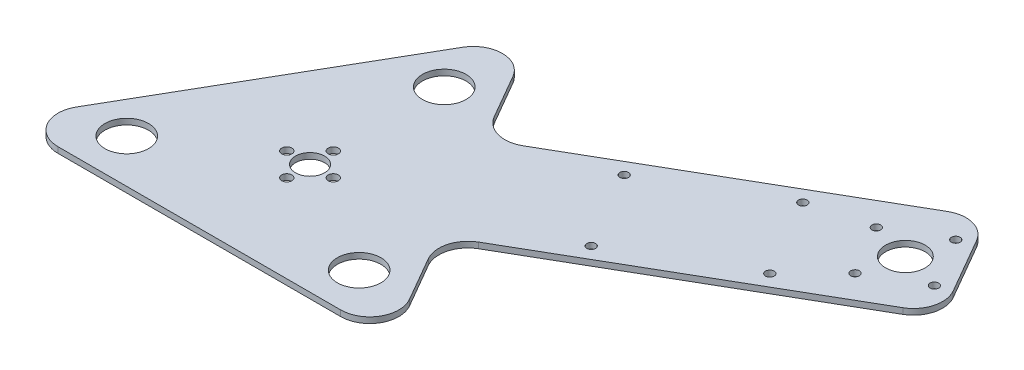
ISO-10303-21;
HEADER;
FILE_DESCRIPTION(('STEP AP214'),'2;1');
FILE_NAME('part.step','',(''),(''),'','','');
FILE_SCHEMA(('AUTOMOTIVE_DESIGN { 1 0 10303 214 1 1 1 1 }'));
ENDSEC;
DATA;
#1=APPLICATION_CONTEXT('core data for automotive mechanical design processes');
#2=APPLICATION_PROTOCOL_DEFINITION('international standard','automotive_design',2000,#1);
#3=PRODUCT_CONTEXT('',#1,'mechanical');
#4=PRODUCT('Part','Part','',(#3));
#5=PRODUCT_RELATED_PRODUCT_CATEGORY('part','',(#4));
#6=PRODUCT_DEFINITION_FORMATION('','',#4);
#7=PRODUCT_DEFINITION_CONTEXT('part definition',#1,'design');
#8=PRODUCT_DEFINITION('design','',#6,#7);
#9=PRODUCT_DEFINITION_SHAPE('','',#8);
#10=(LENGTH_UNIT() NAMED_UNIT(*) SI_UNIT(.MILLI.,.METRE.));
#11=(NAMED_UNIT(*) PLANE_ANGLE_UNIT() SI_UNIT($,.RADIAN.));
#12=(NAMED_UNIT(*) SI_UNIT($,.STERADIAN.) SOLID_ANGLE_UNIT());
#13=UNCERTAINTY_MEASURE_WITH_UNIT(LENGTH_MEASURE(1.E-05),#10,'distance_accuracy_value','');
#14=(GEOMETRIC_REPRESENTATION_CONTEXT(3) GLOBAL_UNCERTAINTY_ASSIGNED_CONTEXT((#13)) GLOBAL_UNIT_ASSIGNED_CONTEXT((#10,
#11,#12)) REPRESENTATION_CONTEXT('',''));
#15=CARTESIAN_POINT('',(0.,0.,0.));
#16=DIRECTION('',(0.,0.,1.));
#17=DIRECTION('',(1.,0.,0.));
#18=AXIS2_PLACEMENT_3D('',#15,#16,#17);
#19=CARTESIAN_POINT('',(65.9807621135332,2.,38.0940107675853));
#20=DIRECTION('',(-0.866025403784439,0.,0.5));
#21=DIRECTION('',(0.5,0.,0.866025403784439));
#22=AXIS2_PLACEMENT_3D('',#19,#20,#21);
#23=PLANE('',#22);
#24=DIRECTION('',(-0.5,0.,-0.866025403784439));
#25=VECTOR('',#24,1.);
#26=CARTESIAN_POINT('',(65.9807621135332,2.,38.0940107675853));
#27=LINE('',#26,#25);
#28=CARTESIAN_POINT('',(17.4903810567665,2.,-45.8937929011101));
#29=VERTEX_POINT('',#28);
#30=CARTESIAN_POINT('',(8.66025403784439,2.,-61.1880215351698));
#31=VERTEX_POINT('',#30);
#32=EDGE_CURVE('E306',#29,#31,#27,.T.);
#33=ORIENTED_EDGE('',*,*,#32,.F.);
#34=DIRECTION('',(0.,1.,0.));
#35=VECTOR('',#34,1.);
#36=CARTESIAN_POINT('',(17.4903810567665,2.,-45.89379290111));
#37=LINE('',#36,#35);
#38=CARTESIAN_POINT('',(17.4903810567665,0.,-45.8937929011101));
#39=VERTEX_POINT('',#38);
#40=EDGE_CURVE('E196',#29,#39,#37,.F.);
#41=ORIENTED_EDGE('',*,*,#40,.T.);
#42=DIRECTION('',(-0.5,0.,-0.866025403784439));
#43=VECTOR('',#42,1.);
#44=CARTESIAN_POINT('',(65.9807621135332,0.,38.0940107675853));
#45=LINE('',#44,#43);
#46=CARTESIAN_POINT('',(8.66025403784439,0.,-61.1880215351698));
#47=VERTEX_POINT('',#46);
#48=EDGE_CURVE('E303',#39,#47,#45,.T.);
#49=ORIENTED_EDGE('',*,*,#48,.T.);
#50=DIRECTION('',(0.,-1.,0.));
#51=VECTOR('',#50,1.);
#52=CARTESIAN_POINT('',(8.66025403784439,2.,-61.1880215351698));
#53=LINE('',#52,#51);
#54=EDGE_CURVE('E194',#47,#31,#53,.F.);
#55=ORIENTED_EDGE('',*,*,#54,.T.);
#56=EDGE_LOOP('',(#33,#41,#49,#55));
#57=FACE_BOUND('',#56,.T.);
#58=ADVANCED_FACE('F34',(#57),#23,.F.);
#59=CARTESIAN_POINT('',(0.,2.,0.));
#60=DIRECTION('',(0.,1.,0.));
#61=DIRECTION('',(0.,0.,1.));
#62=AXIS2_PLACEMENT_3D('',#59,#60,#61);
#63=PLANE('',#62);
#64=CARTESIAN_POINT('',(8.,2.,0.));
#65=DIRECTION('',(0.,1.,0.));
#66=DIRECTION('',(0.,0.,1.));
#67=AXIS2_PLACEMENT_3D('',#64,#65,#66);
#68=CIRCLE('',#67,1.75);
#69=CARTESIAN_POINT('',(8.,2.,1.75));
#70=VERTEX_POINT('',#69);
#71=EDGE_CURVE('E664',#70,#70,#68,.T.);
#72=ORIENTED_EDGE('',*,*,#71,.F.);
#73=EDGE_LOOP('',(#72));
#74=FACE_BOUND('',#73,.T.);
#75=CARTESIAN_POINT('',(0.,2.,8.));
#76=DIRECTION('',(0.,1.,0.));
#77=DIRECTION('',(0.,0.,1.));
#78=AXIS2_PLACEMENT_3D('',#75,#76,#77);
#79=CIRCLE('',#78,1.75);
#80=CARTESIAN_POINT('',(0.,2.,9.75));
#81=VERTEX_POINT('',#80);
#82=EDGE_CURVE('E670',#81,#81,#79,.T.);
#83=ORIENTED_EDGE('',*,*,#82,.F.);
#84=EDGE_LOOP('',(#83));
#85=FACE_BOUND('',#84,.T.);
#86=CARTESIAN_POINT('',(-8.,2.,0.));
#87=DIRECTION('',(0.,1.,0.));
#88=DIRECTION('',(0.,0.,1.));
#89=AXIS2_PLACEMENT_3D('',#86,#87,#88);
#90=CIRCLE('',#89,1.75);
#91=CARTESIAN_POINT('',(-8.,2.,1.75));
#92=VERTEX_POINT('',#91);
#93=EDGE_CURVE('E678',#92,#92,#90,.T.);
#94=ORIENTED_EDGE('',*,*,#93,.F.);
#95=EDGE_LOOP('',(#94));
#96=FACE_BOUND('',#95,.T.);
#97=CARTESIAN_POINT('',(0.,2.,-8.));
#98=DIRECTION('',(0.,1.,0.));
#99=DIRECTION('',(0.,0.,1.));
#100=AXIS2_PLACEMENT_3D('',#97,#98,#99);
#101=CIRCLE('',#100,1.75);
#102=CARTESIAN_POINT('',(0.,2.,-6.25));
#103=VERTEX_POINT('',#102);
#104=EDGE_CURVE('E667',#103,#103,#101,.T.);
#105=ORIENTED_EDGE('',*,*,#104,.F.);
#106=EDGE_LOOP('',(#105));
#107=FACE_BOUND('',#106,.T.);
#108=CARTESIAN_POINT('',(57.2019052838329,2.,-50.9233937586588));
#109=DIRECTION('',(0.,1.,0.));
#110=DIRECTION('',(0.,0.,1.));
#111=AXIS2_PLACEMENT_3D('',#108,#109,#110);
#112=CIRCLE('',#111,1.5);
#113=CARTESIAN_POINT('',(57.2019052838329,2.,-49.4233937586588));
#114=VERTEX_POINT('',#113);
#115=EDGE_CURVE('E245',#114,#114,#112,.T.);
#116=ORIENTED_EDGE('',*,*,#115,.F.);
#117=EDGE_LOOP('',(#116));
#118=FACE_BOUND('',#117,.T.);
#119=CARTESIAN_POINT('',(111.673048454133,2.,-46.5766062413412));
#120=DIRECTION('',(0.,1.,0.));
#121=DIRECTION('',(0.,0.,1.));
#122=AXIS2_PLACEMENT_3D('',#119,#120,#121);
#123=CIRCLE('',#122,1.5);
#124=CARTESIAN_POINT('',(111.673048454133,2.,-45.0766062413412));
#125=VERTEX_POINT('',#124);
#126=EDGE_CURVE('E687',#125,#125,#123,.T.);
#127=ORIENTED_EDGE('',*,*,#126,.F.);
#128=EDGE_LOOP('',(#127));
#129=FACE_BOUND('',#128,.T.);
#130=CARTESIAN_POINT('',(72.7019052838329,2.,-24.0766062413412));
#131=DIRECTION('',(0.,1.,0.));
#132=DIRECTION('',(0.,0.,1.));
#133=AXIS2_PLACEMENT_3D('',#130,#131,#132);
#134=CIRCLE('',#133,1.5);
#135=CARTESIAN_POINT('',(72.7019052838329,2.,-22.5766062413412));
#136=VERTEX_POINT('',#135);
#137=EDGE_CURVE('E258',#136,#136,#134,.T.);
#138=ORIENTED_EDGE('',*,*,#137,.F.);
#139=EDGE_LOOP('',(#138));
#140=FACE_BOUND('',#139,.T.);
#141=CARTESIAN_POINT('',(96.1730484541326,2.,-73.4233937586588));
#142=DIRECTION('',(0.,1.,0.));
#143=DIRECTION('',(0.,0.,1.));
#144=AXIS2_PLACEMENT_3D('',#141,#142,#143);
#145=CIRCLE('',#144,1.5);
#146=CARTESIAN_POINT('',(96.1730484541326,2.,-71.9233937586588));
#147=VERTEX_POINT('',#146);
#148=EDGE_CURVE('E241',#147,#147,#145,.T.);
#149=ORIENTED_EDGE('',*,*,#148,.F.);
#150=EDGE_LOOP('',(#149));
#151=FACE_BOUND('',#150,.T.);
#152=CARTESIAN_POINT('',(116.243556529821,2.,-78.6602540378444));
#153=DIRECTION('',(0.,1.,0.));
#154=DIRECTION('',(0.,0.,1.));
#155=AXIS2_PLACEMENT_3D('',#152,#153,#154);
#156=CIRCLE('',#155,1.5);
#157=CARTESIAN_POINT('',(116.243556529821,2.,-77.1602540378444));
#158=VERTEX_POINT('',#157);
#159=EDGE_CURVE('E231',#158,#158,#156,.T.);
#160=ORIENTED_EDGE('',*,*,#159,.F.);
#161=EDGE_LOOP('',(#160));
#162=FACE_BOUND('',#161,.T.);
#163=CARTESIAN_POINT('',(126.243556529821,2.,-61.3397459621556));
#164=DIRECTION('',(0.,1.,0.));
#165=DIRECTION('',(0.,0.,1.));
#166=AXIS2_PLACEMENT_3D('',#163,#164,#165);
#167=CIRCLE('',#166,1.5);
#168=CARTESIAN_POINT('',(126.243556529821,2.,-59.8397459621556));
#169=VERTEX_POINT('',#168);
#170=EDGE_CURVE('E262',#169,#169,#167,.T.);
#171=ORIENTED_EDGE('',*,*,#170,.F.);
#172=EDGE_LOOP('',(#171));
#173=FACE_BOUND('',#172,.T.);
#174=CARTESIAN_POINT('',(143.56406460551,2.,-71.3397459621556));
#175=DIRECTION('',(0.,1.,0.));
#176=DIRECTION('',(0.,0.,1.));
#177=AXIS2_PLACEMENT_3D('',#174,#175,#176);
#178=CIRCLE('',#177,1.5);
#179=CARTESIAN_POINT('',(143.56406460551,2.,-69.8397459621556));
#180=VERTEX_POINT('',#179);
#181=EDGE_CURVE('E240',#180,#180,#178,.T.);
#182=ORIENTED_EDGE('',*,*,#181,.F.);
#183=EDGE_LOOP('',(#182));
#184=FACE_BOUND('',#183,.T.);
#185=CARTESIAN_POINT('',(133.56406460551,2.,-88.6602540378444));
#186=DIRECTION('',(0.,1.,0.));
#187=DIRECTION('',(0.,0.,1.));
#188=AXIS2_PLACEMENT_3D('',#185,#186,#187);
#189=CIRCLE('',#188,1.5);
#190=CARTESIAN_POINT('',(133.56406460551,2.,-87.1602540378444));
#191=VERTEX_POINT('',#190);
#192=EDGE_CURVE('E226',#191,#191,#189,.T.);
#193=ORIENTED_EDGE('',*,*,#192,.F.);
#194=EDGE_LOOP('',(#193));
#195=FACE_BOUND('',#194,.T.);
#196=CARTESIAN_POINT('',(129.903810567666,2.,-75.));
#197=DIRECTION('',(0.,1.,0.));
#198=DIRECTION('',(0.,0.,1.));
#199=AXIS2_PLACEMENT_3D('',#196,#197,#198);
#200=CIRCLE('',#199,6.8);
#201=CARTESIAN_POINT('',(129.903810567666,2.,-68.2));
#202=VERTEX_POINT('',#201);
#203=EDGE_CURVE('E222',#202,#202,#200,.T.);
#204=ORIENTED_EDGE('',*,*,#203,.F.);
#205=EDGE_LOOP('',(#204));
#206=FACE_BOUND('',#205,.T.);
#207=CARTESIAN_POINT('',(40.,2.,23.0940107675853));
#208=DIRECTION('',(0.,1.,0.));
#209=DIRECTION('',(0.,0.,1.));
#210=AXIS2_PLACEMENT_3D('',#207,#208,#209);
#211=CIRCLE('',#210,7.5);
#212=CARTESIAN_POINT('',(40.,2.,30.5940107675853));
#213=VERTEX_POINT('',#212);
#214=EDGE_CURVE('E288',#213,#213,#211,.T.);
#215=ORIENTED_EDGE('',*,*,#214,.F.);
#216=EDGE_LOOP('',(#215));
#217=FACE_BOUND('',#216,.T.);
#218=CARTESIAN_POINT('',(0.,2.,-46.1880215351698));
#219=DIRECTION('',(0.,1.,0.));
#220=DIRECTION('',(0.,0.,1.));
#221=AXIS2_PLACEMENT_3D('',#218,#219,#220);
#222=CIRCLE('',#221,7.5);
#223=CARTESIAN_POINT('',(0.,2.,-38.6880215351698));
#224=VERTEX_POINT('',#223);
#225=EDGE_CURVE('E300',#224,#224,#222,.T.);
#226=ORIENTED_EDGE('',*,*,#225,.F.);
#227=EDGE_LOOP('',(#226));
#228=FACE_BOUND('',#227,.T.);
#229=DIRECTION('',(-0.5,0.,-0.866025403784438));
#230=VECTOR('',#229,1.);
#231=CARTESIAN_POINT('',(153.394191624432,2.,-64.3134665205268));
#232=LINE('',#231,#230);
#233=CARTESIAN_POINT('',(148.394191624432,2.,-72.9737205583712));
#234=VERTEX_POINT('',#233);
#235=CARTESIAN_POINT('',(137.394191624432,2.,-92.0262794416288));
#236=VERTEX_POINT('',#235);
#237=EDGE_CURVE('E142',#234,#236,#232,.T.);
#238=ORIENTED_EDGE('',*,*,#237,.T.);
#239=CARTESIAN_POINT('',(128.733937586588,2.,-87.0262794416289));
#240=DIRECTION('',(0.,1.,0.));
#241=DIRECTION('',(0.,0.,1.));
#242=AXIS2_PLACEMENT_3D('',#239,#240,#241);
#243=CIRCLE('',#242,10.);
#244=CARTESIAN_POINT('',(123.733937586588,2.,-95.6865334794733));
#245=VERTEX_POINT('',#244);
#246=EDGE_CURVE('E148',#236,#245,#243,.T.);
#247=ORIENTED_EDGE('',*,*,#246,.T.);
#248=DIRECTION('',(-0.866025403784439,0.,0.5));
#249=VECTOR('',#248,1.);
#250=CARTESIAN_POINT('',(22.4903810567665,2.,-37.2335388632657));
#251=LINE('',#250,#249);
#252=CARTESIAN_POINT('',(31.1506350946109,2.,-42.2335388632657));
#253=VERTEX_POINT('',#252);
#254=EDGE_CURVE('E158',#245,#253,#251,.T.);
#255=ORIENTED_EDGE('',*,*,#254,.T.);
#256=CARTESIAN_POINT('',(26.1506350946109,2.,-50.89379290111));
#257=DIRECTION('',(0.,1.,0.));
#258=DIRECTION('',(0.,0.,1.));
#259=AXIS2_PLACEMENT_3D('',#256,#257,#258);
#260=CIRCLE('',#259,10.);
#261=EDGE_CURVE('E214',#253,#29,#260,.F.);
#262=ORIENTED_EDGE('',*,*,#261,.T.);
#263=ORIENTED_EDGE('',*,*,#32,.T.);
#264=CARTESIAN_POINT('',(0.,2.,-56.1880215351698));
#265=DIRECTION('',(0.,1.,0.));
#266=DIRECTION('',(0.,0.,1.));
#267=AXIS2_PLACEMENT_3D('',#264,#265,#266);
#268=CIRCLE('',#267,10.);
#269=CARTESIAN_POINT('',(-8.66025403784439,2.,-61.1880215351698));
#270=VERTEX_POINT('',#269);
#271=EDGE_CURVE('E149',#31,#270,#268,.T.);
#272=ORIENTED_EDGE('',*,*,#271,.T.);
#273=DIRECTION('',(-0.5,0.,0.866025403784439));
#274=VECTOR('',#273,1.);
#275=CARTESIAN_POINT('',(0.,2.,-76.1880215351698));
#276=LINE('',#275,#274);
#277=CARTESIAN_POINT('',(-57.3205080756888,2.,23.0940107675853));
#278=VERTEX_POINT('',#277);
#279=EDGE_CURVE('E166',#270,#278,#276,.T.);
#280=ORIENTED_EDGE('',*,*,#279,.T.);
#281=CARTESIAN_POINT('',(-48.6602540378444,2.,28.0940107675853));
#282=DIRECTION('',(0.,1.,0.));
#283=DIRECTION('',(0.,0.,1.));
#284=AXIS2_PLACEMENT_3D('',#281,#282,#283);
#285=CIRCLE('',#284,10.);
#286=CARTESIAN_POINT('',(-48.6602540378444,2.,38.0940107675853));
#287=VERTEX_POINT('',#286);
#288=EDGE_CURVE('E163',#278,#287,#285,.T.);
#289=ORIENTED_EDGE('',*,*,#288,.T.);
#290=DIRECTION('',(1.,0.,0.));
#291=VECTOR('',#290,1.);
#292=CARTESIAN_POINT('',(-65.9807621135332,2.,38.0940107675853));
#293=LINE('',#292,#291);
#294=CARTESIAN_POINT('',(48.6602540378444,2.,38.0940107675853));
#295=VERTEX_POINT('',#294);
#296=EDGE_CURVE('E161',#287,#295,#293,.T.);
#297=ORIENTED_EDGE('',*,*,#296,.T.);
#298=CARTESIAN_POINT('',(48.6602540378444,2.,28.0940107675853));
#299=DIRECTION('',(0.,1.,0.));
#300=DIRECTION('',(0.,0.,1.));
#301=AXIS2_PLACEMENT_3D('',#298,#299,#300);
#302=CIRCLE('',#301,10.);
#303=CARTESIAN_POINT('',(57.3205080756888,2.,23.0940107675853));
#304=VERTEX_POINT('',#303);
#305=EDGE_CURVE('E173',#295,#304,#302,.T.);
#306=ORIENTED_EDGE('',*,*,#305,.T.);
#307=CARTESIAN_POINT('',(48.4903810567665,2.,7.79978213352515));
#308=VERTEX_POINT('',#307);
#309=EDGE_CURVE('E309',#304,#308,#27,.T.);
#310=ORIENTED_EDGE('',*,*,#309,.T.);
#311=CARTESIAN_POINT('',(57.1506350946109,2.,2.79978213352515));
#312=DIRECTION('',(0.,1.,0.));
#313=DIRECTION('',(0.,0.,1.));
#314=AXIS2_PLACEMENT_3D('',#311,#312,#313);
#315=CIRCLE('',#314,10.);
#316=CARTESIAN_POINT('',(52.1506350946109,2.,-5.86047190431924));
#317=VERTEX_POINT('',#316);
#318=EDGE_CURVE('E43',#308,#317,#315,.F.);
#319=ORIENTED_EDGE('',*,*,#318,.T.);
#320=DIRECTION('',(0.866025403784439,0.,-0.5));
#321=VECTOR('',#320,1.);
#322=CARTESIAN_POINT('',(43.4903810567665,2.,-0.860471904319243));
#323=LINE('',#322,#321);
#324=CARTESIAN_POINT('',(144.733937586588,2.,-59.3134665205268));
#325=VERTEX_POINT('',#324);
#326=EDGE_CURVE('E143',#317,#325,#323,.T.);
#327=ORIENTED_EDGE('',*,*,#326,.T.);
#328=CARTESIAN_POINT('',(139.733937586588,2.,-67.9737205583712));
#329=DIRECTION('',(0.,1.,0.));
#330=DIRECTION('',(0.,0.,1.));
#331=AXIS2_PLACEMENT_3D('',#328,#329,#330);
#332=CIRCLE('',#331,10.);
#333=EDGE_CURVE('E138',#325,#234,#332,.T.);
#334=ORIENTED_EDGE('',*,*,#333,.T.);
#335=EDGE_LOOP('',(#238,#247,#255,#262,#263,#272,#280,#289,#297,#306,#310,#319,#327,#334));
#336=FACE_BOUND('',#335,.T.);
#337=CARTESIAN_POINT('',(-40.,2.,23.0940107675853));
#338=DIRECTION('',(0.,1.,0.));
#339=DIRECTION('',(0.,0.,1.));
#340=AXIS2_PLACEMENT_3D('',#337,#338,#339);
#341=CIRCLE('',#340,7.5);
#342=CARTESIAN_POINT('',(-40.,2.,30.5940107675853));
#343=VERTEX_POINT('',#342);
#344=EDGE_CURVE('E294',#343,#343,#341,.T.);
#345=ORIENTED_EDGE('',*,*,#344,.F.);
#346=EDGE_LOOP('',(#345));
#347=FACE_BOUND('',#346,.T.);
#348=CARTESIAN_POINT('',(0.,2.,0.));
#349=DIRECTION('',(0.,1.,0.));
#350=DIRECTION('',(0.,0.,1.));
#351=AXIS2_PLACEMENT_3D('',#348,#349,#350);
#352=CIRCLE('',#351,5.);
#353=CARTESIAN_POINT('',(0.,2.,5.));
#354=VERTEX_POINT('',#353);
#355=EDGE_CURVE('E282',#354,#354,#352,.T.);
#356=ORIENTED_EDGE('',*,*,#355,.F.);
#357=EDGE_LOOP('',(#356));
#358=FACE_BOUND('',#357,.T.);
#359=ADVANCED_FACE('F140',(#74,#85,#96,#107,#118,#129,#140,#151,#162,#173,#184,#195,#206,#217,
#228,#336,#347,#358),#63,.T.);
#360=CARTESIAN_POINT('',(0.,0.,0.));
#361=DIRECTION('',(0.,1.,0.));
#362=DIRECTION('',(0.,0.,1.));
#363=AXIS2_PLACEMENT_3D('',#360,#361,#362);
#364=PLANE('',#363);
#365=CARTESIAN_POINT('',(8.,0.,0.));
#366=DIRECTION('',(0.,1.,0.));
#367=DIRECTION('',(0.,0.,1.));
#368=AXIS2_PLACEMENT_3D('',#365,#366,#367);
#369=CIRCLE('',#368,1.75);
#370=CARTESIAN_POINT('',(8.,0.,1.75));
#371=VERTEX_POINT('',#370);
#372=EDGE_CURVE('E661',#371,#371,#369,.T.);
#373=ORIENTED_EDGE('',*,*,#372,.T.);
#374=EDGE_LOOP('',(#373));
#375=FACE_BOUND('',#374,.T.);
#376=CARTESIAN_POINT('',(0.,0.,8.));
#377=DIRECTION('',(0.,1.,0.));
#378=DIRECTION('',(0.,0.,1.));
#379=AXIS2_PLACEMENT_3D('',#376,#377,#378);
#380=CIRCLE('',#379,1.75);
#381=CARTESIAN_POINT('',(0.,0.,9.75));
#382=VERTEX_POINT('',#381);
#383=EDGE_CURVE('E665',#382,#382,#380,.T.);
#384=ORIENTED_EDGE('',*,*,#383,.T.);
#385=EDGE_LOOP('',(#384));
#386=FACE_BOUND('',#385,.T.);
#387=CARTESIAN_POINT('',(-8.,0.,0.));
#388=DIRECTION('',(0.,1.,0.));
#389=DIRECTION('',(0.,0.,1.));
#390=AXIS2_PLACEMENT_3D('',#387,#388,#389);
#391=CIRCLE('',#390,1.75);
#392=CARTESIAN_POINT('',(-8.,0.,1.75));
#393=VERTEX_POINT('',#392);
#394=EDGE_CURVE('E675',#393,#393,#391,.T.);
#395=ORIENTED_EDGE('',*,*,#394,.T.);
#396=EDGE_LOOP('',(#395));
#397=FACE_BOUND('',#396,.T.);
#398=CARTESIAN_POINT('',(0.,0.,-8.));
#399=DIRECTION('',(0.,1.,0.));
#400=DIRECTION('',(0.,0.,1.));
#401=AXIS2_PLACEMENT_3D('',#398,#399,#400);
#402=CIRCLE('',#401,1.75);
#403=CARTESIAN_POINT('',(0.,0.,-6.25));
#404=VERTEX_POINT('',#403);
#405=EDGE_CURVE('E681',#404,#404,#402,.T.);
#406=ORIENTED_EDGE('',*,*,#405,.T.);
#407=EDGE_LOOP('',(#406));
#408=FACE_BOUND('',#407,.T.);
#409=CARTESIAN_POINT('',(57.2019052838329,0.,-50.9233937586588));
#410=DIRECTION('',(0.,1.,0.));
#411=DIRECTION('',(0.,0.,1.));
#412=AXIS2_PLACEMENT_3D('',#409,#410,#411);
#413=CIRCLE('',#412,1.5);
#414=CARTESIAN_POINT('',(57.2019052838329,0.,-49.4233937586588));
#415=VERTEX_POINT('',#414);
#416=EDGE_CURVE('E38',#415,#415,#413,.T.);
#417=ORIENTED_EDGE('',*,*,#416,.T.);
#418=EDGE_LOOP('',(#417));
#419=FACE_BOUND('',#418,.T.);
#420=CARTESIAN_POINT('',(111.673048454133,0.,-46.5766062413412));
#421=DIRECTION('',(0.,1.,0.));
#422=DIRECTION('',(0.,0.,1.));
#423=AXIS2_PLACEMENT_3D('',#420,#421,#422);
#424=CIRCLE('',#423,1.5);
#425=CARTESIAN_POINT('',(111.673048454133,0.,-45.0766062413412));
#426=VERTEX_POINT('',#425);
#427=EDGE_CURVE('E244',#426,#426,#424,.T.);
#428=ORIENTED_EDGE('',*,*,#427,.T.);
#429=EDGE_LOOP('',(#428));
#430=FACE_BOUND('',#429,.T.);
#431=CARTESIAN_POINT('',(72.7019052838329,0.,-24.0766062413412));
#432=DIRECTION('',(0.,1.,0.));
#433=DIRECTION('',(0.,0.,1.));
#434=AXIS2_PLACEMENT_3D('',#431,#432,#433);
#435=CIRCLE('',#434,1.5);
#436=CARTESIAN_POINT('',(72.7019052838329,0.,-22.5766062413412));
#437=VERTEX_POINT('',#436);
#438=EDGE_CURVE('E242',#437,#437,#435,.T.);
#439=ORIENTED_EDGE('',*,*,#438,.T.);
#440=EDGE_LOOP('',(#439));
#441=FACE_BOUND('',#440,.T.);
#442=CARTESIAN_POINT('',(96.1730484541326,0.,-73.4233937586588));
#443=DIRECTION('',(0.,1.,0.));
#444=DIRECTION('',(0.,0.,1.));
#445=AXIS2_PLACEMENT_3D('',#442,#443,#444);
#446=CIRCLE('',#445,1.5);
#447=CARTESIAN_POINT('',(96.1730484541326,0.,-71.9233937586588));
#448=VERTEX_POINT('',#447);
#449=EDGE_CURVE('E237',#448,#448,#446,.T.);
#450=ORIENTED_EDGE('',*,*,#449,.T.);
#451=EDGE_LOOP('',(#450));
#452=FACE_BOUND('',#451,.T.);
#453=CARTESIAN_POINT('',(116.243556529821,0.,-78.6602540378444));
#454=DIRECTION('',(0.,1.,0.));
#455=DIRECTION('',(0.,0.,1.));
#456=AXIS2_PLACEMENT_3D('',#453,#454,#455);
#457=CIRCLE('',#456,1.5);
#458=CARTESIAN_POINT('',(116.243556529821,0.,-77.1602540378444));
#459=VERTEX_POINT('',#458);
#460=EDGE_CURVE('E234',#459,#459,#457,.T.);
#461=ORIENTED_EDGE('',*,*,#460,.T.);
#462=EDGE_LOOP('',(#461));
#463=FACE_BOUND('',#462,.T.);
#464=CARTESIAN_POINT('',(126.243556529821,0.,-61.3397459621556));
#465=DIRECTION('',(0.,1.,0.));
#466=DIRECTION('',(0.,0.,1.));
#467=AXIS2_PLACEMENT_3D('',#464,#465,#466);
#468=CIRCLE('',#467,1.5);
#469=CARTESIAN_POINT('',(126.243556529821,0.,-59.8397459621556));
#470=VERTEX_POINT('',#469);
#471=EDGE_CURVE('E230',#470,#470,#468,.T.);
#472=ORIENTED_EDGE('',*,*,#471,.T.);
#473=EDGE_LOOP('',(#472));
#474=FACE_BOUND('',#473,.T.);
#475=CARTESIAN_POINT('',(143.56406460551,0.,-71.3397459621556));
#476=DIRECTION('',(0.,1.,0.));
#477=DIRECTION('',(0.,0.,1.));
#478=AXIS2_PLACEMENT_3D('',#475,#476,#477);
#479=CIRCLE('',#478,1.5);
#480=CARTESIAN_POINT('',(143.56406460551,0.,-69.8397459621556));
#481=VERTEX_POINT('',#480);
#482=EDGE_CURVE('E227',#481,#481,#479,.T.);
#483=ORIENTED_EDGE('',*,*,#482,.T.);
#484=EDGE_LOOP('',(#483));
#485=FACE_BOUND('',#484,.T.);
#486=CARTESIAN_POINT('',(133.56406460551,0.,-88.6602540378444));
#487=DIRECTION('',(0.,1.,0.));
#488=DIRECTION('',(0.,0.,1.));
#489=AXIS2_PLACEMENT_3D('',#486,#487,#488);
#490=CIRCLE('',#489,1.5);
#491=CARTESIAN_POINT('',(133.56406460551,0.,-87.1602540378444));
#492=VERTEX_POINT('',#491);
#493=EDGE_CURVE('E223',#492,#492,#490,.T.);
#494=ORIENTED_EDGE('',*,*,#493,.T.);
#495=EDGE_LOOP('',(#494));
#496=FACE_BOUND('',#495,.T.);
#497=CARTESIAN_POINT('',(129.903810567666,0.,-75.));
#498=DIRECTION('',(0.,1.,0.));
#499=DIRECTION('',(0.,0.,1.));
#500=AXIS2_PLACEMENT_3D('',#497,#498,#499);
#501=CIRCLE('',#500,6.8);
#502=CARTESIAN_POINT('',(129.903810567666,0.,-68.2));
#503=VERTEX_POINT('',#502);
#504=EDGE_CURVE('E219',#503,#503,#501,.T.);
#505=ORIENTED_EDGE('',*,*,#504,.T.);
#506=EDGE_LOOP('',(#505));
#507=FACE_BOUND('',#506,.T.);
#508=DIRECTION('',(-0.866025403784439,0.,0.5));
#509=VECTOR('',#508,1.);
#510=CARTESIAN_POINT('',(22.4903810567665,0.,-37.2335388632657));
#511=LINE('',#510,#509);
#512=CARTESIAN_POINT('',(123.733937586588,0.,-95.6865334794733));
#513=VERTEX_POINT('',#512);
#514=CARTESIAN_POINT('',(31.1506350946109,0.,-42.2335388632657));
#515=VERTEX_POINT('',#514);
#516=EDGE_CURVE('E275',#513,#515,#511,.T.);
#517=ORIENTED_EDGE('',*,*,#516,.F.);
#518=CARTESIAN_POINT('',(128.733937586588,0.,-87.0262794416289));
#519=DIRECTION('',(0.,1.,0.));
#520=DIRECTION('',(0.,0.,1.));
#521=AXIS2_PLACEMENT_3D('',#518,#519,#520);
#522=CIRCLE('',#521,10.);
#523=CARTESIAN_POINT('',(137.394191624432,0.,-92.0262794416288));
#524=VERTEX_POINT('',#523);
#525=EDGE_CURVE('E189',#513,#524,#522,.F.);
#526=ORIENTED_EDGE('',*,*,#525,.T.);
#527=DIRECTION('',(-0.5,0.,-0.866025403784438));
#528=VECTOR('',#527,1.);
#529=CARTESIAN_POINT('',(153.394191624432,0.,-64.3134665205268));
#530=LINE('',#529,#528);
#531=CARTESIAN_POINT('',(148.394191624432,0.,-72.9737205583712));
#532=VERTEX_POINT('',#531);
#533=EDGE_CURVE('E273',#532,#524,#530,.T.);
#534=ORIENTED_EDGE('',*,*,#533,.F.);
#535=CARTESIAN_POINT('',(139.733937586588,0.,-67.9737205583712));
#536=DIRECTION('',(0.,1.,0.));
#537=DIRECTION('',(0.,0.,1.));
#538=AXIS2_PLACEMENT_3D('',#535,#536,#537);
#539=CIRCLE('',#538,10.);
#540=CARTESIAN_POINT('',(144.733937586588,0.,-59.3134665205268));
#541=VERTEX_POINT('',#540);
#542=EDGE_CURVE('E51',#532,#541,#539,.F.);
#543=ORIENTED_EDGE('',*,*,#542,.T.);
#544=DIRECTION('',(0.866025403784439,0.,-0.5));
#545=VECTOR('',#544,1.);
#546=CARTESIAN_POINT('',(43.4903810567665,0.,-0.860471904319243));
#547=LINE('',#546,#545);
#548=CARTESIAN_POINT('',(52.1506350946109,0.,-5.86047190431924));
#549=VERTEX_POINT('',#548);
#550=EDGE_CURVE('E271',#549,#541,#547,.T.);
#551=ORIENTED_EDGE('',*,*,#550,.F.);
#552=CARTESIAN_POINT('',(57.1506350946109,0.,2.79978213352515));
#553=DIRECTION('',(0.,1.,0.));
#554=DIRECTION('',(0.,0.,1.));
#555=AXIS2_PLACEMENT_3D('',#552,#553,#554);
#556=CIRCLE('',#555,10.);
#557=CARTESIAN_POINT('',(48.4903810567665,0.,7.79978213352515));
#558=VERTEX_POINT('',#557);
#559=EDGE_CURVE('E11',#549,#558,#556,.T.);
#560=ORIENTED_EDGE('',*,*,#559,.T.);
#561=CARTESIAN_POINT('',(57.3205080756888,0.,23.0940107675853));
#562=VERTEX_POINT('',#561);
#563=EDGE_CURVE('E313',#562,#558,#45,.T.);
#564=ORIENTED_EDGE('',*,*,#563,.F.);
#565=CARTESIAN_POINT('',(48.6602540378444,0.,28.0940107675853));
#566=DIRECTION('',(0.,1.,0.));
#567=DIRECTION('',(0.,0.,1.));
#568=AXIS2_PLACEMENT_3D('',#565,#566,#567);
#569=CIRCLE('',#568,10.);
#570=CARTESIAN_POINT('',(48.6602540378444,0.,38.0940107675853));
#571=VERTEX_POINT('',#570);
#572=EDGE_CURVE('E184',#562,#571,#569,.F.);
#573=ORIENTED_EDGE('',*,*,#572,.T.);
#574=DIRECTION('',(1.,0.,0.));
#575=VECTOR('',#574,1.);
#576=CARTESIAN_POINT('',(-65.9807621135332,0.,38.0940107675853));
#577=LINE('',#576,#575);
#578=CARTESIAN_POINT('',(-48.6602540378444,0.,38.0940107675853));
#579=VERTEX_POINT('',#578);
#580=EDGE_CURVE('E169',#579,#571,#577,.T.);
#581=ORIENTED_EDGE('',*,*,#580,.F.);
#582=CARTESIAN_POINT('',(-48.6602540378444,0.,28.0940107675853));
#583=DIRECTION('',(0.,1.,0.));
#584=DIRECTION('',(0.,0.,1.));
#585=AXIS2_PLACEMENT_3D('',#582,#583,#584);
#586=CIRCLE('',#585,10.);
#587=CARTESIAN_POINT('',(-57.3205080756888,0.,23.0940107675853));
#588=VERTEX_POINT('',#587);
#589=EDGE_CURVE('E182',#579,#588,#586,.F.);
#590=ORIENTED_EDGE('',*,*,#589,.T.);
#591=DIRECTION('',(-0.5,0.,0.866025403784439));
#592=VECTOR('',#591,1.);
#593=CARTESIAN_POINT('',(0.,0.,-76.1880215351698));
#594=LINE('',#593,#592);
#595=CARTESIAN_POINT('',(-8.66025403784439,0.,-61.1880215351698));
#596=VERTEX_POINT('',#595);
#597=EDGE_CURVE('E314',#596,#588,#594,.T.);
#598=ORIENTED_EDGE('',*,*,#597,.F.);
#599=CARTESIAN_POINT('',(0.,0.,-56.1880215351698));
#600=DIRECTION('',(0.,1.,0.));
#601=DIRECTION('',(0.,0.,1.));
#602=AXIS2_PLACEMENT_3D('',#599,#600,#601);
#603=CIRCLE('',#602,10.);
#604=EDGE_CURVE('E186',#596,#47,#603,.F.);
#605=ORIENTED_EDGE('',*,*,#604,.T.);
#606=ORIENTED_EDGE('',*,*,#48,.F.);
#607=CARTESIAN_POINT('',(26.1506350946109,0.,-50.89379290111));
#608=DIRECTION('',(0.,1.,0.));
#609=DIRECTION('',(0.,0.,1.));
#610=AXIS2_PLACEMENT_3D('',#607,#608,#609);
#611=CIRCLE('',#610,10.);
#612=EDGE_CURVE('E216',#39,#515,#611,.T.);
#613=ORIENTED_EDGE('',*,*,#612,.T.);
#614=EDGE_LOOP('',(#517,#526,#534,#543,#551,#560,#564,#573,#581,#590,#598,#605,#606,#613));
#615=FACE_BOUND('',#614,.T.);
#616=CARTESIAN_POINT('',(0.,0.,-46.1880215351698));
#617=DIRECTION('',(0.,1.,0.));
#618=DIRECTION('',(0.,0.,1.));
#619=AXIS2_PLACEMENT_3D('',#616,#617,#618);
#620=CIRCLE('',#619,7.5);
#621=CARTESIAN_POINT('',(0.,0.,-38.6880215351698));
#622=VERTEX_POINT('',#621);
#623=EDGE_CURVE('E297',#622,#622,#620,.T.);
#624=ORIENTED_EDGE('',*,*,#623,.T.);
#625=EDGE_LOOP('',(#624));
#626=FACE_BOUND('',#625,.T.);
#627=CARTESIAN_POINT('',(-40.,0.,23.0940107675853));
#628=DIRECTION('',(0.,1.,0.));
#629=DIRECTION('',(0.,0.,1.));
#630=AXIS2_PLACEMENT_3D('',#627,#628,#629);
#631=CIRCLE('',#630,7.5);
#632=CARTESIAN_POINT('',(-40.,0.,30.5940107675853));
#633=VERTEX_POINT('',#632);
#634=EDGE_CURVE('E291',#633,#633,#631,.T.);
#635=ORIENTED_EDGE('',*,*,#634,.T.);
#636=EDGE_LOOP('',(#635));
#637=FACE_BOUND('',#636,.T.);
#638=CARTESIAN_POINT('',(40.,0.,23.0940107675853));
#639=DIRECTION('',(0.,1.,0.));
#640=DIRECTION('',(0.,0.,1.));
#641=AXIS2_PLACEMENT_3D('',#638,#639,#640);
#642=CIRCLE('',#641,7.5);
#643=CARTESIAN_POINT('',(40.,0.,30.5940107675853));
#644=VERTEX_POINT('',#643);
#645=EDGE_CURVE('E285',#644,#644,#642,.T.);
#646=ORIENTED_EDGE('',*,*,#645,.T.);
#647=EDGE_LOOP('',(#646));
#648=FACE_BOUND('',#647,.T.);
#649=CARTESIAN_POINT('',(0.,0.,0.));
#650=DIRECTION('',(0.,1.,0.));
#651=DIRECTION('',(0.,0.,1.));
#652=AXIS2_PLACEMENT_3D('',#649,#650,#651);
#653=CIRCLE('',#652,5.);
#654=CARTESIAN_POINT('',(0.,0.,5.));
#655=VERTEX_POINT('',#654);
#656=EDGE_CURVE('E278',#655,#655,#653,.T.);
#657=ORIENTED_EDGE('',*,*,#656,.T.);
#658=EDGE_LOOP('',(#657));
#659=FACE_BOUND('',#658,.T.);
#660=ADVANCED_FACE('F333',(#375,#386,#397,#408,#419,#430,#441,#452,#463,#474,#485,#496,#507,
#615,#626,#637,#648,#659),#364,.F.);
#661=ORIENTED_EDGE('',*,*,#563,.T.);
#662=DIRECTION('',(0.,1.,0.));
#663=VECTOR('',#662,1.);
#664=CARTESIAN_POINT('',(48.4903810567665,2.,7.79978213352515));
#665=LINE('',#664,#663);
#666=EDGE_CURVE('E201',#558,#308,#665,.T.);
#667=ORIENTED_EDGE('',*,*,#666,.T.);
#668=ORIENTED_EDGE('',*,*,#309,.F.);
#669=DIRECTION('',(0.,-1.,0.));
#670=VECTOR('',#669,1.);
#671=CARTESIAN_POINT('',(57.3205080756888,2.,23.0940107675853));
#672=LINE('',#671,#670);
#673=EDGE_CURVE('E198',#304,#562,#672,.T.);
#674=ORIENTED_EDGE('',*,*,#673,.T.);
#675=EDGE_LOOP('',(#661,#667,#668,#674));
#676=FACE_BOUND('',#675,.T.);
#677=ADVANCED_FACE('F324',(#676),#23,.F.);
#678=CARTESIAN_POINT('',(0.,2.,-76.1880215351698));
#679=DIRECTION('',(0.866025403784439,0.,0.5));
#680=DIRECTION('',(0.5,0.,-0.866025403784439));
#681=AXIS2_PLACEMENT_3D('',#678,#679,#680);
#682=PLANE('',#681);
#683=ORIENTED_EDGE('',*,*,#279,.F.);
#684=DIRECTION('',(0.,-1.,0.));
#685=VECTOR('',#684,1.);
#686=CARTESIAN_POINT('',(-8.66025403784439,2.,-61.1880215351698));
#687=LINE('',#686,#685);
#688=EDGE_CURVE('E206',#270,#596,#687,.T.);
#689=ORIENTED_EDGE('',*,*,#688,.T.);
#690=ORIENTED_EDGE('',*,*,#597,.T.);
#691=DIRECTION('',(0.,-1.,0.));
#692=VECTOR('',#691,1.);
#693=CARTESIAN_POINT('',(-57.3205080756888,2.,23.0940107675853));
#694=LINE('',#693,#692);
#695=EDGE_CURVE('E204',#588,#278,#694,.F.);
#696=ORIENTED_EDGE('',*,*,#695,.T.);
#697=EDGE_LOOP('',(#683,#689,#690,#696));
#698=FACE_BOUND('',#697,.T.);
#699=ADVANCED_FACE('F373',(#698),#682,.F.);
#700=CARTESIAN_POINT('',(-65.9807621135332,2.,38.0940107675853));
#701=DIRECTION('',(0.,0.,-1.));
#702=DIRECTION('',(-1.,0.,0.));
#703=AXIS2_PLACEMENT_3D('',#700,#701,#702);
#704=PLANE('',#703);
#705=ORIENTED_EDGE('',*,*,#580,.T.);
#706=DIRECTION('',(0.,-1.,0.));
#707=VECTOR('',#706,1.);
#708=CARTESIAN_POINT('',(48.6602540378444,2.,38.0940107675853));
#709=LINE('',#708,#707);
#710=EDGE_CURVE('E212',#571,#295,#709,.F.);
#711=ORIENTED_EDGE('',*,*,#710,.T.);
#712=ORIENTED_EDGE('',*,*,#296,.F.);
#713=DIRECTION('',(0.,-1.,0.));
#714=VECTOR('',#713,1.);
#715=CARTESIAN_POINT('',(-48.6602540378444,2.,38.0940107675853));
#716=LINE('',#715,#714);
#717=EDGE_CURVE('E209',#287,#579,#716,.T.);
#718=ORIENTED_EDGE('',*,*,#717,.T.);
#719=EDGE_LOOP('',(#705,#711,#712,#718));
#720=FACE_BOUND('',#719,.T.);
#721=ADVANCED_FACE('F377',(#720),#704,.F.);
#722=CARTESIAN_POINT('',(0.,2.,-46.1880215351698));
#723=DIRECTION('',(0.,-1.,0.));
#724=DIRECTION('',(0.,0.,-1.));
#725=AXIS2_PLACEMENT_3D('',#722,#723,#724);
#726=CYLINDRICAL_SURFACE('',#725,7.5);
#727=ORIENTED_EDGE('',*,*,#225,.T.);
#728=EDGE_LOOP('',(#727));
#729=FACE_BOUND('',#728,.T.);
#730=ORIENTED_EDGE('',*,*,#623,.F.);
#731=EDGE_LOOP('',(#730));
#732=FACE_BOUND('',#731,.T.);
#733=ADVANCED_FACE('F381',(#729,#732),#726,.F.);
#734=CARTESIAN_POINT('',(-40.,2.,23.0940107675853));
#735=DIRECTION('',(0.,-1.,0.));
#736=DIRECTION('',(0.,0.,-1.));
#737=AXIS2_PLACEMENT_3D('',#734,#735,#736);
#738=CYLINDRICAL_SURFACE('',#737,7.5);
#739=ORIENTED_EDGE('',*,*,#344,.T.);
#740=EDGE_LOOP('',(#739));
#741=FACE_BOUND('',#740,.T.);
#742=ORIENTED_EDGE('',*,*,#634,.F.);
#743=EDGE_LOOP('',(#742));
#744=FACE_BOUND('',#743,.T.);
#745=ADVANCED_FACE('F358',(#741,#744),#738,.F.);
#746=CARTESIAN_POINT('',(40.,2.,23.0940107675853));
#747=DIRECTION('',(0.,-1.,0.));
#748=DIRECTION('',(0.,0.,-1.));
#749=AXIS2_PLACEMENT_3D('',#746,#747,#748);
#750=CYLINDRICAL_SURFACE('',#749,7.5);
#751=ORIENTED_EDGE('',*,*,#214,.T.);
#752=EDGE_LOOP('',(#751));
#753=FACE_BOUND('',#752,.T.);
#754=ORIENTED_EDGE('',*,*,#645,.F.);
#755=EDGE_LOOP('',(#754));
#756=FACE_BOUND('',#755,.T.);
#757=ADVANCED_FACE('F349',(#753,#756),#750,.F.);
#758=CARTESIAN_POINT('',(0.,2.,0.));
#759=DIRECTION('',(0.,-1.,0.));
#760=DIRECTION('',(0.,0.,-1.));
#761=AXIS2_PLACEMENT_3D('',#758,#759,#760);
#762=CYLINDRICAL_SURFACE('',#761,5.);
#763=ORIENTED_EDGE('',*,*,#355,.T.);
#764=EDGE_LOOP('',(#763));
#765=FACE_BOUND('',#764,.T.);
#766=ORIENTED_EDGE('',*,*,#656,.F.);
#767=EDGE_LOOP('',(#766));
#768=FACE_BOUND('',#767,.T.);
#769=ADVANCED_FACE('F347',(#765,#768),#762,.F.);
#770=CARTESIAN_POINT('',(43.4903810567665,0.,-0.860471904319243));
#771=DIRECTION('',(0.5,0.,0.866025403784439));
#772=DIRECTION('',(0.866025403784439,0.,-0.5));
#773=AXIS2_PLACEMENT_3D('',#770,#771,#772);
#774=PLANE('',#773);
#775=ORIENTED_EDGE('',*,*,#550,.T.);
#776=DIRECTION('',(0.,1.,0.));
#777=VECTOR('',#776,1.);
#778=CARTESIAN_POINT('',(144.733937586588,0.,-59.3134665205268));
#779=LINE('',#778,#777);
#780=EDGE_CURVE('E192',#541,#325,#779,.T.);
#781=ORIENTED_EDGE('',*,*,#780,.T.);
#782=ORIENTED_EDGE('',*,*,#326,.F.);
#783=DIRECTION('',(0.,1.,0.));
#784=VECTOR('',#783,1.);
#785=CARTESIAN_POINT('',(52.1506350946109,0.,-5.86047190431924));
#786=LINE('',#785,#784);
#787=EDGE_CURVE('E58',#317,#549,#786,.F.);
#788=ORIENTED_EDGE('',*,*,#787,.T.);
#789=EDGE_LOOP('',(#775,#781,#782,#788));
#790=FACE_BOUND('',#789,.T.);
#791=ADVANCED_FACE('F331',(#790),#774,.T.);
#792=CARTESIAN_POINT('',(22.4903810567665,0.,-37.2335388632657));
#793=DIRECTION('',(-0.5,0.,-0.866025403784439));
#794=DIRECTION('',(-0.866025403784439,0.,0.5));
#795=AXIS2_PLACEMENT_3D('',#792,#793,#794);
#796=PLANE('',#795);
#797=ORIENTED_EDGE('',*,*,#254,.F.);
#798=DIRECTION('',(0.,1.,0.));
#799=VECTOR('',#798,1.);
#800=CARTESIAN_POINT('',(123.733937586588,0.,-95.6865334794732));
#801=LINE('',#800,#799);
#802=EDGE_CURVE('E180',#245,#513,#801,.F.);
#803=ORIENTED_EDGE('',*,*,#802,.T.);
#804=ORIENTED_EDGE('',*,*,#516,.T.);
#805=DIRECTION('',(0.,1.,0.));
#806=VECTOR('',#805,1.);
#807=CARTESIAN_POINT('',(31.1506350946109,0.,-42.2335388632657));
#808=LINE('',#807,#806);
#809=EDGE_CURVE('E177',#515,#253,#808,.T.);
#810=ORIENTED_EDGE('',*,*,#809,.T.);
#811=EDGE_LOOP('',(#797,#803,#804,#810));
#812=FACE_BOUND('',#811,.T.);
#813=ADVANCED_FACE('F356',(#812),#796,.T.);
#814=CARTESIAN_POINT('',(153.394191624432,0.,-64.3134665205268));
#815=DIRECTION('',(0.866025403784438,0.,-0.5));
#816=DIRECTION('',(-0.5,0.,-0.866025403784439));
#817=AXIS2_PLACEMENT_3D('',#814,#815,#816);
#818=PLANE('',#817);
#819=ORIENTED_EDGE('',*,*,#533,.T.);
#820=DIRECTION('',(0.,1.,0.));
#821=VECTOR('',#820,1.);
#822=CARTESIAN_POINT('',(137.394191624432,0.,-92.0262794416288));
#823=LINE('',#822,#821);
#824=EDGE_CURVE('E157',#524,#236,#823,.T.);
#825=ORIENTED_EDGE('',*,*,#824,.T.);
#826=ORIENTED_EDGE('',*,*,#237,.F.);
#827=DIRECTION('',(0.,1.,0.));
#828=VECTOR('',#827,1.);
#829=CARTESIAN_POINT('',(148.394191624432,0.,-72.9737205583712));
#830=LINE('',#829,#828);
#831=EDGE_CURVE('E155',#234,#532,#830,.F.);
#832=ORIENTED_EDGE('',*,*,#831,.T.);
#833=EDGE_LOOP('',(#819,#825,#826,#832));
#834=FACE_BOUND('',#833,.T.);
#835=ADVANCED_FACE('F154',(#834),#818,.T.);
#836=CARTESIAN_POINT('',(128.733937586588,0.,-87.0262794416289));
#837=DIRECTION('',(0.,1.,0.));
#838=DIRECTION('',(0.,0.,1.));
#839=AXIS2_PLACEMENT_3D('',#836,#837,#838);
#840=CYLINDRICAL_SURFACE('',#839,10.);
#841=ORIENTED_EDGE('',*,*,#525,.F.);
#842=ORIENTED_EDGE('',*,*,#802,.F.);
#843=ORIENTED_EDGE('',*,*,#246,.F.);
#844=ORIENTED_EDGE('',*,*,#824,.F.);
#845=EDGE_LOOP('',(#841,#842,#843,#844));
#846=FACE_BOUND('',#845,.T.);
#847=ADVANCED_FACE('F453',(#846),#840,.T.);
#848=CARTESIAN_POINT('',(139.733937586588,0.,-67.9737205583712));
#849=DIRECTION('',(0.,1.,0.));
#850=DIRECTION('',(0.,0.,1.));
#851=AXIS2_PLACEMENT_3D('',#848,#849,#850);
#852=CYLINDRICAL_SURFACE('',#851,10.);
#853=ORIENTED_EDGE('',*,*,#542,.F.);
#854=ORIENTED_EDGE('',*,*,#831,.F.);
#855=ORIENTED_EDGE('',*,*,#333,.F.);
#856=ORIENTED_EDGE('',*,*,#780,.F.);
#857=EDGE_LOOP('',(#853,#854,#855,#856));
#858=FACE_BOUND('',#857,.T.);
#859=ADVANCED_FACE('F160',(#858),#852,.T.);
#860=CARTESIAN_POINT('',(26.1506350946109,0.,-50.89379290111));
#861=DIRECTION('',(0.,1.,0.));
#862=DIRECTION('',(0.,0.,1.));
#863=AXIS2_PLACEMENT_3D('',#860,#861,#862);
#864=CYLINDRICAL_SURFACE('',#863,10.);
#865=ORIENTED_EDGE('',*,*,#612,.F.);
#866=ORIENTED_EDGE('',*,*,#40,.F.);
#867=ORIENTED_EDGE('',*,*,#261,.F.);
#868=ORIENTED_EDGE('',*,*,#809,.F.);
#869=EDGE_LOOP('',(#865,#866,#867,#868));
#870=FACE_BOUND('',#869,.T.);
#871=ADVANCED_FACE('F470',(#870),#864,.F.);
#872=CARTESIAN_POINT('',(57.1506350946109,2.,2.79978213352515));
#873=DIRECTION('',(0.,1.,0.));
#874=DIRECTION('',(0.,0.,1.));
#875=AXIS2_PLACEMENT_3D('',#872,#873,#874);
#876=CYLINDRICAL_SURFACE('',#875,10.);
#877=ORIENTED_EDGE('',*,*,#559,.F.);
#878=ORIENTED_EDGE('',*,*,#787,.F.);
#879=ORIENTED_EDGE('',*,*,#318,.F.);
#880=ORIENTED_EDGE('',*,*,#666,.F.);
#881=EDGE_LOOP('',(#877,#878,#879,#880));
#882=FACE_BOUND('',#881,.T.);
#883=ADVANCED_FACE('F330',(#882),#876,.F.);
#884=CARTESIAN_POINT('',(0.,2.,-56.1880215351698));
#885=DIRECTION('',(0.,-1.,0.));
#886=DIRECTION('',(0.,0.,-1.));
#887=AXIS2_PLACEMENT_3D('',#884,#885,#886);
#888=CYLINDRICAL_SURFACE('',#887,10.);
#889=ORIENTED_EDGE('',*,*,#271,.F.);
#890=ORIENTED_EDGE('',*,*,#54,.F.);
#891=ORIENTED_EDGE('',*,*,#604,.F.);
#892=ORIENTED_EDGE('',*,*,#688,.F.);
#893=EDGE_LOOP('',(#889,#890,#891,#892));
#894=FACE_BOUND('',#893,.T.);
#895=ADVANCED_FACE('F488',(#894),#888,.T.);
#896=CARTESIAN_POINT('',(48.6602540378444,2.,28.0940107675853));
#897=DIRECTION('',(0.,-1.,0.));
#898=DIRECTION('',(0.,0.,-1.));
#899=AXIS2_PLACEMENT_3D('',#896,#897,#898);
#900=CYLINDRICAL_SURFACE('',#899,10.);
#901=ORIENTED_EDGE('',*,*,#305,.F.);
#902=ORIENTED_EDGE('',*,*,#710,.F.);
#903=ORIENTED_EDGE('',*,*,#572,.F.);
#904=ORIENTED_EDGE('',*,*,#673,.F.);
#905=EDGE_LOOP('',(#901,#902,#903,#904));
#906=FACE_BOUND('',#905,.T.);
#907=ADVANCED_FACE('F497',(#906),#900,.T.);
#908=CARTESIAN_POINT('',(-48.6602540378444,2.,28.0940107675853));
#909=DIRECTION('',(0.,-1.,0.));
#910=DIRECTION('',(0.,0.,-1.));
#911=AXIS2_PLACEMENT_3D('',#908,#909,#910);
#912=CYLINDRICAL_SURFACE('',#911,10.);
#913=ORIENTED_EDGE('',*,*,#288,.F.);
#914=ORIENTED_EDGE('',*,*,#695,.F.);
#915=ORIENTED_EDGE('',*,*,#589,.F.);
#916=ORIENTED_EDGE('',*,*,#717,.F.);
#917=EDGE_LOOP('',(#913,#914,#915,#916));
#918=FACE_BOUND('',#917,.T.);
#919=ADVANCED_FACE('F36',(#918),#912,.T.);
#920=CARTESIAN_POINT('',(129.903810567666,-8.,-75.));
#921=DIRECTION('',(0.,1.,0.));
#922=DIRECTION('',(0.,0.,1.));
#923=AXIS2_PLACEMENT_3D('',#920,#921,#922);
#924=CYLINDRICAL_SURFACE('',#923,6.8);
#925=ORIENTED_EDGE('',*,*,#203,.T.);
#926=EDGE_LOOP('',(#925));
#927=FACE_BOUND('',#926,.T.);
#928=ORIENTED_EDGE('',*,*,#504,.F.);
#929=EDGE_LOOP('',(#928));
#930=FACE_BOUND('',#929,.T.);
#931=ADVANCED_FACE('F515',(#927,#930),#924,.F.);
#932=CARTESIAN_POINT('',(133.56406460551,-8.,-88.6602540378444));
#933=DIRECTION('',(0.,1.,0.));
#934=DIRECTION('',(0.,0.,1.));
#935=AXIS2_PLACEMENT_3D('',#932,#933,#934);
#936=CYLINDRICAL_SURFACE('',#935,1.5);
#937=ORIENTED_EDGE('',*,*,#192,.T.);
#938=EDGE_LOOP('',(#937));
#939=FACE_BOUND('',#938,.T.);
#940=ORIENTED_EDGE('',*,*,#493,.F.);
#941=EDGE_LOOP('',(#940));
#942=FACE_BOUND('',#941,.T.);
#943=ADVANCED_FACE('F524',(#939,#942),#936,.F.);
#944=CARTESIAN_POINT('',(143.56406460551,-8.,-71.3397459621556));
#945=DIRECTION('',(0.,1.,0.));
#946=DIRECTION('',(0.,0.,1.));
#947=AXIS2_PLACEMENT_3D('',#944,#945,#946);
#948=CYLINDRICAL_SURFACE('',#947,1.5);
#949=ORIENTED_EDGE('',*,*,#181,.T.);
#950=EDGE_LOOP('',(#949));
#951=FACE_BOUND('',#950,.T.);
#952=ORIENTED_EDGE('',*,*,#482,.F.);
#953=EDGE_LOOP('',(#952));
#954=FACE_BOUND('',#953,.T.);
#955=ADVANCED_FACE('F534',(#951,#954),#948,.F.);
#956=CARTESIAN_POINT('',(126.243556529821,-8.,-61.3397459621556));
#957=DIRECTION('',(0.,1.,0.));
#958=DIRECTION('',(0.,0.,1.));
#959=AXIS2_PLACEMENT_3D('',#956,#957,#958);
#960=CYLINDRICAL_SURFACE('',#959,1.5);
#961=ORIENTED_EDGE('',*,*,#170,.T.);
#962=EDGE_LOOP('',(#961));
#963=FACE_BOUND('',#962,.T.);
#964=ORIENTED_EDGE('',*,*,#471,.F.);
#965=EDGE_LOOP('',(#964));
#966=FACE_BOUND('',#965,.T.);
#967=ADVANCED_FACE('F544',(#963,#966),#960,.F.);
#968=CARTESIAN_POINT('',(116.243556529821,-8.,-78.6602540378444));
#969=DIRECTION('',(0.,1.,0.));
#970=DIRECTION('',(0.,0.,1.));
#971=AXIS2_PLACEMENT_3D('',#968,#969,#970);
#972=CYLINDRICAL_SURFACE('',#971,1.5);
#973=ORIENTED_EDGE('',*,*,#159,.T.);
#974=EDGE_LOOP('',(#973));
#975=FACE_BOUND('',#974,.T.);
#976=ORIENTED_EDGE('',*,*,#460,.F.);
#977=EDGE_LOOP('',(#976));
#978=FACE_BOUND('',#977,.T.);
#979=ADVANCED_FACE('F554',(#975,#978),#972,.F.);
#980=CARTESIAN_POINT('',(96.1730484541326,-8.,-73.4233937586588));
#981=DIRECTION('',(0.,1.,0.));
#982=DIRECTION('',(0.,0.,1.));
#983=AXIS2_PLACEMENT_3D('',#980,#981,#982);
#984=CYLINDRICAL_SURFACE('',#983,1.5);
#985=ORIENTED_EDGE('',*,*,#148,.T.);
#986=EDGE_LOOP('',(#985));
#987=FACE_BOUND('',#986,.T.);
#988=ORIENTED_EDGE('',*,*,#449,.F.);
#989=EDGE_LOOP('',(#988));
#990=FACE_BOUND('',#989,.T.);
#991=ADVANCED_FACE('F564',(#987,#990),#984,.F.);
#992=CARTESIAN_POINT('',(72.7019052838329,-8.,-24.0766062413412));
#993=DIRECTION('',(0.,1.,0.));
#994=DIRECTION('',(0.,0.,1.));
#995=AXIS2_PLACEMENT_3D('',#992,#993,#994);
#996=CYLINDRICAL_SURFACE('',#995,1.5);
#997=ORIENTED_EDGE('',*,*,#137,.T.);
#998=EDGE_LOOP('',(#997));
#999=FACE_BOUND('',#998,.T.);
#1000=ORIENTED_EDGE('',*,*,#438,.F.);
#1001=EDGE_LOOP('',(#1000));
#1002=FACE_BOUND('',#1001,.T.);
#1003=ADVANCED_FACE('F574',(#999,#1002),#996,.F.);
#1004=CARTESIAN_POINT('',(111.673048454133,-8.,-46.5766062413412));
#1005=DIRECTION('',(0.,1.,0.));
#1006=DIRECTION('',(0.,0.,1.));
#1007=AXIS2_PLACEMENT_3D('',#1004,#1005,#1006);
#1008=CYLINDRICAL_SURFACE('',#1007,1.5);
#1009=ORIENTED_EDGE('',*,*,#126,.T.);
#1010=EDGE_LOOP('',(#1009));
#1011=FACE_BOUND('',#1010,.T.);
#1012=ORIENTED_EDGE('',*,*,#427,.F.);
#1013=EDGE_LOOP('',(#1012));
#1014=FACE_BOUND('',#1013,.T.);
#1015=ADVANCED_FACE('F583',(#1011,#1014),#1008,.F.);
#1016=CARTESIAN_POINT('',(57.2019052838329,-8.,-50.9233937586588));
#1017=DIRECTION('',(0.,1.,0.));
#1018=DIRECTION('',(0.,0.,1.));
#1019=AXIS2_PLACEMENT_3D('',#1016,#1017,#1018);
#1020=CYLINDRICAL_SURFACE('',#1019,1.5);
#1021=ORIENTED_EDGE('',*,*,#115,.T.);
#1022=EDGE_LOOP('',(#1021));
#1023=FACE_BOUND('',#1022,.T.);
#1024=ORIENTED_EDGE('',*,*,#416,.F.);
#1025=EDGE_LOOP('',(#1024));
#1026=FACE_BOUND('',#1025,.T.);
#1027=ADVANCED_FACE('F593',(#1023,#1026),#1020,.F.);
#1028=CARTESIAN_POINT('',(0.,0.,-8.));
#1029=DIRECTION('',(0.,1.,0.));
#1030=DIRECTION('',(0.,0.,1.));
#1031=AXIS2_PLACEMENT_3D('',#1028,#1029,#1030);
#1032=CYLINDRICAL_SURFACE('',#1031,1.75);
#1033=ORIENTED_EDGE('',*,*,#405,.F.);
#1034=EDGE_LOOP('',(#1033));
#1035=FACE_BOUND('',#1034,.T.);
#1036=ORIENTED_EDGE('',*,*,#104,.T.);
#1037=EDGE_LOOP('',(#1036));
#1038=FACE_BOUND('',#1037,.T.);
#1039=ADVANCED_FACE('F603',(#1035,#1038),#1032,.F.);
#1040=CARTESIAN_POINT('',(-8.,0.,0.));
#1041=DIRECTION('',(0.,1.,0.));
#1042=DIRECTION('',(0.,0.,1.));
#1043=AXIS2_PLACEMENT_3D('',#1040,#1041,#1042);
#1044=CYLINDRICAL_SURFACE('',#1043,1.75);
#1045=ORIENTED_EDGE('',*,*,#394,.F.);
#1046=EDGE_LOOP('',(#1045));
#1047=FACE_BOUND('',#1046,.T.);
#1048=ORIENTED_EDGE('',*,*,#93,.T.);
#1049=EDGE_LOOP('',(#1048));
#1050=FACE_BOUND('',#1049,.T.);
#1051=ADVANCED_FACE('F624',(#1047,#1050),#1044,.F.);
#1052=CARTESIAN_POINT('',(0.,0.,8.));
#1053=DIRECTION('',(0.,1.,0.));
#1054=DIRECTION('',(0.,0.,1.));
#1055=AXIS2_PLACEMENT_3D('',#1052,#1053,#1054);
#1056=CYLINDRICAL_SURFACE('',#1055,1.75);
#1057=ORIENTED_EDGE('',*,*,#383,.F.);
#1058=EDGE_LOOP('',(#1057));
#1059=FACE_BOUND('',#1058,.T.);
#1060=ORIENTED_EDGE('',*,*,#82,.T.);
#1061=EDGE_LOOP('',(#1060));
#1062=FACE_BOUND('',#1061,.T.);
#1063=ADVANCED_FACE('F634',(#1059,#1062),#1056,.F.);
#1064=CARTESIAN_POINT('',(8.,0.,0.));
#1065=DIRECTION('',(0.,1.,0.));
#1066=DIRECTION('',(0.,0.,1.));
#1067=AXIS2_PLACEMENT_3D('',#1064,#1065,#1066);
#1068=CYLINDRICAL_SURFACE('',#1067,1.75);
#1069=ORIENTED_EDGE('',*,*,#372,.F.);
#1070=EDGE_LOOP('',(#1069));
#1071=FACE_BOUND('',#1070,.T.);
#1072=ORIENTED_EDGE('',*,*,#71,.T.);
#1073=EDGE_LOOP('',(#1072));
#1074=FACE_BOUND('',#1073,.T.);
#1075=ADVANCED_FACE('F644',(#1071,#1074),#1068,.F.);
#1076=CLOSED_SHELL('',(#58,#359,#660,#677,#699,#721,#733,#745,#757,#769,#791,#813,#835,#847,
#859,#871,#883,#895,#907,#919,#931,#943,#955,#967,#979,#991,#1003,#1015,#1027,#1039,#1051,#1063,#1075));
#1077=MANIFOLD_SOLID_BREP('B2',#1076);
#1078=ADVANCED_BREP_SHAPE_REPRESENTATION('',(#18,#1077),#14);
#1079=SHAPE_DEFINITION_REPRESENTATION(#9,#1078);
ENDSEC;
END-ISO-10303-21;
